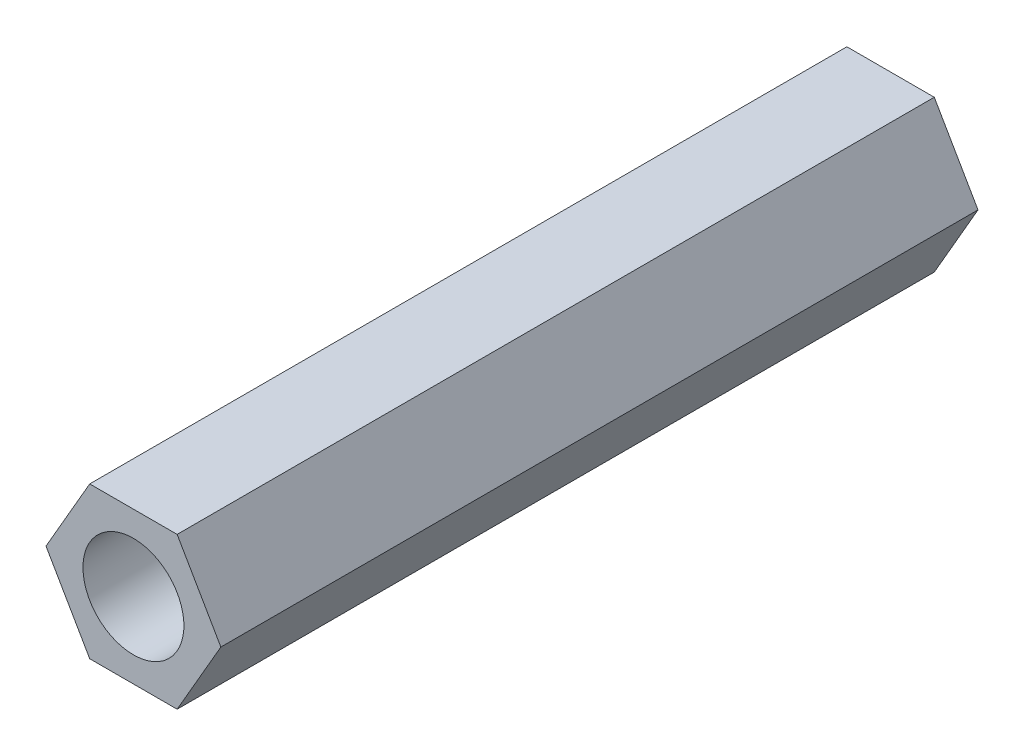
ISO-10303-21;
HEADER;
FILE_DESCRIPTION(('STEP AP214'),'2;1');
FILE_NAME('part.step','',(''),(''),'','','');
FILE_SCHEMA(('AUTOMOTIVE_DESIGN { 1 0 10303 214 1 1 1 1 }'));
ENDSEC;
DATA;
#1=APPLICATION_CONTEXT('core data for automotive mechanical design processes');
#2=APPLICATION_PROTOCOL_DEFINITION('international standard','automotive_design',2000,#1);
#3=PRODUCT_CONTEXT('',#1,'mechanical');
#4=PRODUCT('Part','Part','',(#3));
#5=PRODUCT_RELATED_PRODUCT_CATEGORY('part','',(#4));
#6=PRODUCT_DEFINITION_FORMATION('','',#4);
#7=PRODUCT_DEFINITION_CONTEXT('part definition',#1,'design');
#8=PRODUCT_DEFINITION('design','',#6,#7);
#9=PRODUCT_DEFINITION_SHAPE('','',#8);
#10=(LENGTH_UNIT() NAMED_UNIT(*) SI_UNIT(.MILLI.,.METRE.));
#11=(NAMED_UNIT(*) PLANE_ANGLE_UNIT() SI_UNIT($,.RADIAN.));
#12=(NAMED_UNIT(*) SI_UNIT($,.STERADIAN.) SOLID_ANGLE_UNIT());
#13=UNCERTAINTY_MEASURE_WITH_UNIT(LENGTH_MEASURE(1.E-05),#10,'distance_accuracy_value','');
#14=(GEOMETRIC_REPRESENTATION_CONTEXT(3) GLOBAL_UNCERTAINTY_ASSIGNED_CONTEXT((#13)) GLOBAL_UNIT_ASSIGNED_CONTEXT((#10,
#11,#12)) REPRESENTATION_CONTEXT('',''));
#15=CARTESIAN_POINT('',(0.,0.,0.));
#16=DIRECTION('',(0.,0.,1.));
#17=DIRECTION('',(1.,0.,0.));
#18=AXIS2_PLACEMENT_3D('',#15,#16,#17);
#19=CARTESIAN_POINT('',(3.46410161513818,-6.00000000000011,60.));
#20=DIRECTION('',(0.,-1.,0.));
#21=DIRECTION('',(0.,0.,-1.));
#22=AXIS2_PLACEMENT_3D('',#19,#20,#21);
#23=PLANE('',#22);
#24=DIRECTION('',(-1.,0.,0.));
#25=VECTOR('',#24,1.);
#26=CARTESIAN_POINT('',(3.46410161513818,-6.00000000000011,0.));
#27=LINE('',#26,#25);
#28=CARTESIAN_POINT('',(3.46410161513818,-6.00000000000011,0.));
#29=VERTEX_POINT('',#28);
#30=CARTESIAN_POINT('',(-3.46410161513782,-6.00000000000011,0.));
#31=VERTEX_POINT('',#30);
#32=EDGE_CURVE('E126',#29,#31,#27,.T.);
#33=ORIENTED_EDGE('',*,*,#32,.F.);
#34=DIRECTION('',(0.,0.,-1.));
#35=VECTOR('',#34,1.);
#36=CARTESIAN_POINT('',(3.46410161513818,-6.00000000000011,60.));
#37=LINE('',#36,#35);
#38=CARTESIAN_POINT('',(3.46410161513818,-6.00000000000011,60.));
#39=VERTEX_POINT('',#38);
#40=EDGE_CURVE('E11',#39,#29,#37,.T.);
#41=ORIENTED_EDGE('',*,*,#40,.F.);
#42=DIRECTION('',(-1.,0.,0.));
#43=VECTOR('',#42,1.);
#44=CARTESIAN_POINT('',(3.46410161513818,-6.00000000000011,60.));
#45=LINE('',#44,#43);
#46=CARTESIAN_POINT('',(-3.46410161513782,-6.00000000000011,60.));
#47=VERTEX_POINT('',#46);
#48=EDGE_CURVE('E141',#39,#47,#45,.T.);
#49=ORIENTED_EDGE('',*,*,#48,.T.);
#50=DIRECTION('',(0.,0.,-1.));
#51=VECTOR('',#50,1.);
#52=CARTESIAN_POINT('',(-3.46410161513782,-6.00000000000011,60.));
#53=LINE('',#52,#51);
#54=EDGE_CURVE('E44',#47,#31,#53,.T.);
#55=ORIENTED_EDGE('',*,*,#54,.T.);
#56=EDGE_LOOP('',(#33,#41,#49,#55));
#57=FACE_BOUND('',#56,.T.);
#58=ADVANCED_FACE('F41',(#57),#23,.T.);
#59=CARTESIAN_POINT('',(6.928203230276,0.,60.));
#60=DIRECTION('',(0.866025403784439,-0.5,0.));
#61=DIRECTION('',(0.5,0.866025403784439,0.));
#62=AXIS2_PLACEMENT_3D('',#59,#60,#61);
#63=PLANE('',#62);
#64=DIRECTION('',(-0.5,-0.866025403784439,0.));
#65=VECTOR('',#64,1.);
#66=CARTESIAN_POINT('',(6.928203230276,0.,0.));
#67=LINE('',#66,#65);
#68=CARTESIAN_POINT('',(6.928203230276,0.,0.));
#69=VERTEX_POINT('',#68);
#70=EDGE_CURVE('E139',#69,#29,#67,.T.);
#71=ORIENTED_EDGE('',*,*,#70,.F.);
#72=DIRECTION('',(0.,0.,-1.));
#73=VECTOR('',#72,1.);
#74=CARTESIAN_POINT('',(6.928203230276,0.,60.));
#75=LINE('',#74,#73);
#76=CARTESIAN_POINT('',(6.928203230276,0.,60.));
#77=VERTEX_POINT('',#76);
#78=EDGE_CURVE('E50',#77,#69,#75,.T.);
#79=ORIENTED_EDGE('',*,*,#78,.F.);
#80=DIRECTION('',(-0.5,-0.866025403784439,0.));
#81=VECTOR('',#80,1.);
#82=CARTESIAN_POINT('',(6.928203230276,0.,60.));
#83=LINE('',#82,#81);
#84=EDGE_CURVE('E116',#77,#39,#83,.T.);
#85=ORIENTED_EDGE('',*,*,#84,.T.);
#86=ORIENTED_EDGE('',*,*,#40,.T.);
#87=EDGE_LOOP('',(#71,#79,#85,#86));
#88=FACE_BOUND('',#87,.T.);
#89=ADVANCED_FACE('F149',(#88),#63,.T.);
#90=CARTESIAN_POINT('',(3.46410161513818,6.00000000000011,60.));
#91=DIRECTION('',(0.866025403784439,0.5,0.));
#92=DIRECTION('',(-0.5,0.866025403784439,0.));
#93=AXIS2_PLACEMENT_3D('',#90,#91,#92);
#94=PLANE('',#93);
#95=DIRECTION('',(0.5,-0.866025403784439,0.));
#96=VECTOR('',#95,1.);
#97=CARTESIAN_POINT('',(3.46410161513818,6.00000000000011,0.));
#98=LINE('',#97,#96);
#99=CARTESIAN_POINT('',(3.46410161513818,6.00000000000011,0.));
#100=VERTEX_POINT('',#99);
#101=EDGE_CURVE('E103',#100,#69,#98,.T.);
#102=ORIENTED_EDGE('',*,*,#101,.F.);
#103=DIRECTION('',(0.,0.,-1.));
#104=VECTOR('',#103,1.);
#105=CARTESIAN_POINT('',(3.46410161513818,6.00000000000011,60.));
#106=LINE('',#105,#104);
#107=CARTESIAN_POINT('',(3.46410161513818,6.00000000000011,60.));
#108=VERTEX_POINT('',#107);
#109=EDGE_CURVE('E98',#108,#100,#106,.T.);
#110=ORIENTED_EDGE('',*,*,#109,.F.);
#111=DIRECTION('',(0.5,-0.866025403784439,0.));
#112=VECTOR('',#111,1.);
#113=CARTESIAN_POINT('',(3.46410161513818,6.00000000000011,60.));
#114=LINE('',#113,#112);
#115=EDGE_CURVE('E101',#108,#77,#114,.T.);
#116=ORIENTED_EDGE('',*,*,#115,.T.);
#117=ORIENTED_EDGE('',*,*,#78,.T.);
#118=EDGE_LOOP('',(#102,#110,#116,#117));
#119=FACE_BOUND('',#118,.T.);
#120=ADVANCED_FACE('F100',(#119),#94,.T.);
#121=CARTESIAN_POINT('',(-3.46410161513782,6.00000000000011,60.));
#122=DIRECTION('',(0.,1.,0.));
#123=DIRECTION('',(0.,0.,1.));
#124=AXIS2_PLACEMENT_3D('',#121,#122,#123);
#125=PLANE('',#124);
#126=DIRECTION('',(1.,0.,0.));
#127=VECTOR('',#126,1.);
#128=CARTESIAN_POINT('',(-3.46410161513782,6.00000000000011,0.));
#129=LINE('',#128,#127);
#130=CARTESIAN_POINT('',(-3.46410161513782,6.00000000000011,0.));
#131=VERTEX_POINT('',#130);
#132=EDGE_CURVE('E136',#131,#100,#129,.T.);
#133=ORIENTED_EDGE('',*,*,#132,.F.);
#134=DIRECTION('',(0.,0.,-1.));
#135=VECTOR('',#134,1.);
#136=CARTESIAN_POINT('',(-3.46410161513782,6.00000000000011,60.));
#137=LINE('',#136,#135);
#138=CARTESIAN_POINT('',(-3.46410161513782,6.00000000000011,60.));
#139=VERTEX_POINT('',#138);
#140=EDGE_CURVE('E108',#139,#131,#137,.T.);
#141=ORIENTED_EDGE('',*,*,#140,.F.);
#142=DIRECTION('',(1.,0.,0.));
#143=VECTOR('',#142,1.);
#144=CARTESIAN_POINT('',(-3.46410161513782,6.00000000000011,60.));
#145=LINE('',#144,#143);
#146=EDGE_CURVE('E114',#139,#108,#145,.T.);
#147=ORIENTED_EDGE('',*,*,#146,.T.);
#148=ORIENTED_EDGE('',*,*,#109,.T.);
#149=EDGE_LOOP('',(#133,#141,#147,#148));
#150=FACE_BOUND('',#149,.T.);
#151=ADVANCED_FACE('F118',(#150),#125,.T.);
#152=CARTESIAN_POINT('',(-6.92820323027563,0.,60.));
#153=DIRECTION('',(-0.866025403784439,0.5,0.));
#154=DIRECTION('',(-0.5,-0.866025403784439,0.));
#155=AXIS2_PLACEMENT_3D('',#152,#153,#154);
#156=PLANE('',#155);
#157=DIRECTION('',(0.5,0.866025403784439,0.));
#158=VECTOR('',#157,1.);
#159=CARTESIAN_POINT('',(-6.92820323027563,0.,0.));
#160=LINE('',#159,#158);
#161=CARTESIAN_POINT('',(-6.92820323027563,0.,0.));
#162=VERTEX_POINT('',#161);
#163=EDGE_CURVE('E133',#162,#131,#160,.T.);
#164=ORIENTED_EDGE('',*,*,#163,.F.);
#165=DIRECTION('',(0.,0.,-1.));
#166=VECTOR('',#165,1.);
#167=CARTESIAN_POINT('',(-6.92820323027563,0.,60.));
#168=LINE('',#167,#166);
#169=CARTESIAN_POINT('',(-6.92820323027563,0.,60.));
#170=VERTEX_POINT('',#169);
#171=EDGE_CURVE('E144',#170,#162,#168,.T.);
#172=ORIENTED_EDGE('',*,*,#171,.F.);
#173=DIRECTION('',(0.5,0.866025403784439,0.));
#174=VECTOR('',#173,1.);
#175=CARTESIAN_POINT('',(-6.92820323027563,0.,60.));
#176=LINE('',#175,#174);
#177=EDGE_CURVE('E119',#170,#139,#176,.T.);
#178=ORIENTED_EDGE('',*,*,#177,.T.);
#179=ORIENTED_EDGE('',*,*,#140,.T.);
#180=EDGE_LOOP('',(#164,#172,#178,#179));
#181=FACE_BOUND('',#180,.T.);
#182=ADVANCED_FACE('F162',(#181),#156,.T.);
#183=CARTESIAN_POINT('',(-3.46410161513782,-6.00000000000011,60.));
#184=DIRECTION('',(-0.866025403784439,-0.5,0.));
#185=DIRECTION('',(0.5,-0.866025403784439,0.));
#186=AXIS2_PLACEMENT_3D('',#183,#184,#185);
#187=PLANE('',#186);
#188=DIRECTION('',(-0.5,0.866025403784439,0.));
#189=VECTOR('',#188,1.);
#190=CARTESIAN_POINT('',(-3.46410161513782,-6.00000000000011,0.));
#191=LINE('',#190,#189);
#192=EDGE_CURVE('E129',#31,#162,#191,.T.);
#193=ORIENTED_EDGE('',*,*,#192,.F.);
#194=ORIENTED_EDGE('',*,*,#54,.F.);
#195=DIRECTION('',(-0.5,0.866025403784439,0.));
#196=VECTOR('',#195,1.);
#197=CARTESIAN_POINT('',(-3.46410161513782,-6.00000000000011,60.));
#198=LINE('',#197,#196);
#199=EDGE_CURVE('E121',#47,#170,#198,.T.);
#200=ORIENTED_EDGE('',*,*,#199,.T.);
#201=ORIENTED_EDGE('',*,*,#171,.T.);
#202=EDGE_LOOP('',(#193,#194,#200,#201));
#203=FACE_BOUND('',#202,.T.);
#204=ADVANCED_FACE('F146',(#203),#187,.T.);
#205=CARTESIAN_POINT('',(0.,0.,60.));
#206=DIRECTION('',(0.,0.,-1.));
#207=DIRECTION('',(-1.,0.,0.));
#208=AXIS2_PLACEMENT_3D('',#205,#206,#207);
#209=PLANE('',#208);
#210=CARTESIAN_POINT('',(0.,0.,60.));
#211=DIRECTION('',(0.,0.,-1.));
#212=DIRECTION('',(1.,0.,0.));
#213=AXIS2_PLACEMENT_3D('',#210,#211,#212);
#214=CIRCLE('',#213,4.);
#215=CARTESIAN_POINT('',(-4.,0.,60.));
#216=VERTEX_POINT('',#215);
#217=EDGE_CURVE('E130',#216,#216,#214,.T.);
#218=ORIENTED_EDGE('',*,*,#217,.T.);
#219=EDGE_LOOP('',(#218));
#220=FACE_BOUND('',#219,.T.);
#221=ORIENTED_EDGE('',*,*,#48,.F.);
#222=ORIENTED_EDGE('',*,*,#84,.F.);
#223=ORIENTED_EDGE('',*,*,#115,.F.);
#224=ORIENTED_EDGE('',*,*,#146,.F.);
#225=ORIENTED_EDGE('',*,*,#177,.F.);
#226=ORIENTED_EDGE('',*,*,#199,.F.);
#227=EDGE_LOOP('',(#221,#222,#223,#224,#225,#226));
#228=FACE_BOUND('',#227,.T.);
#229=ADVANCED_FACE('F112',(#220,#228),#209,.F.);
#230=CARTESIAN_POINT('',(0.,0.,0.));
#231=DIRECTION('',(0.,0.,-1.));
#232=DIRECTION('',(-1.,0.,0.));
#233=AXIS2_PLACEMENT_3D('',#230,#231,#232);
#234=PLANE('',#233);
#235=CARTESIAN_POINT('',(0.,0.,0.));
#236=DIRECTION('',(0.,0.,-1.));
#237=DIRECTION('',(1.,0.,0.));
#238=AXIS2_PLACEMENT_3D('',#235,#236,#237);
#239=CIRCLE('',#238,4.);
#240=CARTESIAN_POINT('',(-4.,0.,0.));
#241=VERTEX_POINT('',#240);
#242=EDGE_CURVE('E185',#241,#241,#239,.T.);
#243=ORIENTED_EDGE('',*,*,#242,.F.);
#244=EDGE_LOOP('',(#243));
#245=FACE_BOUND('',#244,.T.);
#246=ORIENTED_EDGE('',*,*,#32,.T.);
#247=ORIENTED_EDGE('',*,*,#192,.T.);
#248=ORIENTED_EDGE('',*,*,#163,.T.);
#249=ORIENTED_EDGE('',*,*,#132,.T.);
#250=ORIENTED_EDGE('',*,*,#101,.T.);
#251=ORIENTED_EDGE('',*,*,#70,.T.);
#252=EDGE_LOOP('',(#246,#247,#248,#249,#250,#251));
#253=FACE_BOUND('',#252,.T.);
#254=ADVANCED_FACE('F148',(#245,#253),#234,.T.);
#255=CARTESIAN_POINT('',(0.,0.,60.));
#256=DIRECTION('',(0.,0.,-1.));
#257=DIRECTION('',(-1.,0.,0.));
#258=AXIS2_PLACEMENT_3D('',#255,#256,#257);
#259=CYLINDRICAL_SURFACE('',#258,4.);
#260=CARTESIAN_POINT('',(-4.,0.,60.));
#261=CARTESIAN_POINT('',(-4.,0.,59.375));
#262=CARTESIAN_POINT('',(-4.,0.,58.75));
#263=CARTESIAN_POINT('',(-4.,0.,57.5));
#264=CARTESIAN_POINT('',(-4.,0.,56.875));
#265=CARTESIAN_POINT('',(-4.,0.,55.625));
#266=CARTESIAN_POINT('',(-4.,0.,55.));
#267=CARTESIAN_POINT('',(-4.,0.,53.75));
#268=CARTESIAN_POINT('',(-4.,0.,53.125));
#269=CARTESIAN_POINT('',(-4.,0.,51.875));
#270=CARTESIAN_POINT('',(-4.,0.,51.25));
#271=CARTESIAN_POINT('',(-4.,0.,50.));
#272=CARTESIAN_POINT('',(-4.,0.,49.375));
#273=CARTESIAN_POINT('',(-4.,0.,48.125));
#274=CARTESIAN_POINT('',(-4.,0.,47.5));
#275=CARTESIAN_POINT('',(-4.,0.,46.25));
#276=CARTESIAN_POINT('',(-4.,0.,45.625));
#277=CARTESIAN_POINT('',(-4.,0.,44.375));
#278=CARTESIAN_POINT('',(-4.,0.,43.75));
#279=CARTESIAN_POINT('',(-4.,0.,42.5));
#280=CARTESIAN_POINT('',(-4.,0.,41.875));
#281=CARTESIAN_POINT('',(-4.,0.,40.625));
#282=CARTESIAN_POINT('',(-4.,0.,40.));
#283=CARTESIAN_POINT('',(-4.,0.,38.75));
#284=CARTESIAN_POINT('',(-4.,0.,38.125));
#285=CARTESIAN_POINT('',(-4.,0.,36.875));
#286=CARTESIAN_POINT('',(-4.,0.,36.25));
#287=CARTESIAN_POINT('',(-4.,0.,35.));
#288=CARTESIAN_POINT('',(-4.,0.,34.375));
#289=CARTESIAN_POINT('',(-4.,0.,33.125));
#290=CARTESIAN_POINT('',(-4.,0.,32.5));
#291=CARTESIAN_POINT('',(-4.,0.,31.25));
#292=CARTESIAN_POINT('',(-4.,0.,30.625));
#293=CARTESIAN_POINT('',(-4.,0.,29.375));
#294=CARTESIAN_POINT('',(-4.,0.,28.75));
#295=CARTESIAN_POINT('',(-4.,0.,27.5));
#296=CARTESIAN_POINT('',(-4.,0.,26.875));
#297=CARTESIAN_POINT('',(-4.,0.,25.625));
#298=CARTESIAN_POINT('',(-4.,0.,25.));
#299=CARTESIAN_POINT('',(-4.,0.,23.75));
#300=CARTESIAN_POINT('',(-4.,0.,23.125));
#301=CARTESIAN_POINT('',(-4.,0.,21.875));
#302=CARTESIAN_POINT('',(-4.,0.,21.25));
#303=CARTESIAN_POINT('',(-4.,0.,20.));
#304=CARTESIAN_POINT('',(-4.,0.,19.375));
#305=CARTESIAN_POINT('',(-4.,0.,18.125));
#306=CARTESIAN_POINT('',(-4.,0.,17.5));
#307=CARTESIAN_POINT('',(-4.,0.,16.25));
#308=CARTESIAN_POINT('',(-4.,0.,15.625));
#309=CARTESIAN_POINT('',(-4.,0.,14.375));
#310=CARTESIAN_POINT('',(-4.,0.,13.75));
#311=CARTESIAN_POINT('',(-4.,0.,12.5));
#312=CARTESIAN_POINT('',(-4.,0.,11.875));
#313=CARTESIAN_POINT('',(-4.,0.,10.625));
#314=CARTESIAN_POINT('',(-4.,0.,10.));
#315=CARTESIAN_POINT('',(-4.,0.,8.75));
#316=CARTESIAN_POINT('',(-4.,0.,8.125));
#317=CARTESIAN_POINT('',(-4.,0.,6.875));
#318=CARTESIAN_POINT('',(-4.,0.,6.25));
#319=CARTESIAN_POINT('',(-4.,0.,5.));
#320=CARTESIAN_POINT('',(-4.,0.,4.375));
#321=CARTESIAN_POINT('',(-4.,0.,3.125));
#322=CARTESIAN_POINT('',(-4.,0.,2.5));
#323=CARTESIAN_POINT('',(-4.,0.,1.25));
#324=CARTESIAN_POINT('',(-4.,0.,0.625000000000001));
#325=CARTESIAN_POINT('',(-4.,0.,0.));
#326=B_SPLINE_CURVE_WITH_KNOTS('',3,(#260,#261,#262,#263,#264,#265,#266,#267,#268,#269,#270,
#271,#272,#273,#274,#275,#276,#277,#278,#279,#280,#281,#282,#283,#284,#285,#286,#287,#288,#289,
#290,#291,#292,#293,#294,#295,#296,#297,#298,#299,#300,#301,#302,#303,#304,#305,#306,#307,#308,
#309,#310,#311,#312,#313,#314,#315,#316,#317,#318,#319,#320,#321,#322,#323,#324,#325),
.UNSPECIFIED.,.F.,.F.,(4,2,2,2,2,2,2,2,2,2,2,2,2,2,2,2,2,2,2,2,2,2,2,2,2,2,2,2,2,2,2,2,4),(0.,
1.87499999999999,3.75,5.625,7.49999999999999,9.37499999999999,11.25,13.125,15.,16.875,18.75,
20.625,22.5,24.375,26.25,28.125,30.,31.875,33.75,35.625,37.5,39.375,41.25,43.125,45.,46.875,
48.75,50.625,52.5,54.375,56.25,58.125,60.),.UNSPECIFIED.);
#327=EDGE_CURVE('BSEAM173',#216,#241,#326,.T.);
#328=ORIENTED_EDGE('',*,*,#217,.F.);
#329=ORIENTED_EDGE('',*,*,#242,.T.);
#330=ORIENTED_EDGE('',*,*,#327,.T.);
#331=ORIENTED_EDGE('',*,*,#327,.F.);
#332=EDGE_LOOP('',(#328,#330,#329,#331));
#333=FACE_BOUND('',#332,.T.);
#334=ADVANCED_FACE('F173',(#333),#259,.F.);
#335=CLOSED_SHELL('',(#58,#89,#120,#151,#182,#204,#229,#254,#334));
#336=MANIFOLD_SOLID_BREP('B2',#335);
#337=ADVANCED_BREP_SHAPE_REPRESENTATION('',(#18,#336),#14);
#338=SHAPE_DEFINITION_REPRESENTATION(#9,#337);
ENDSEC;
END-ISO-10303-21;
